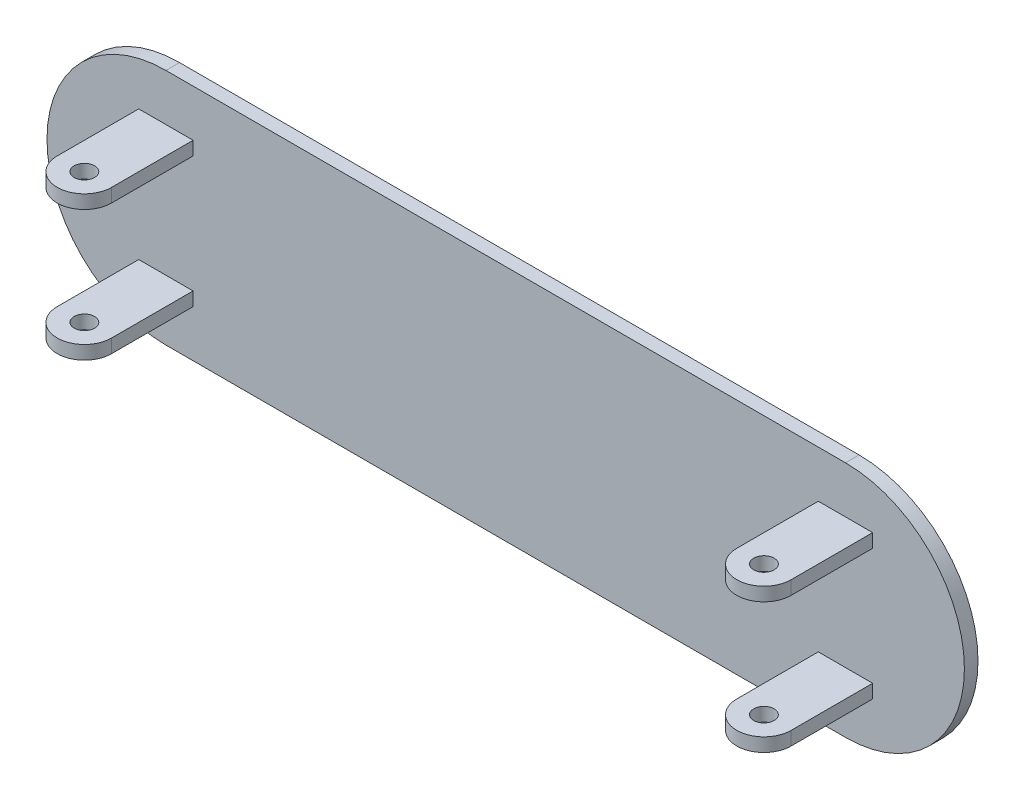
ISO-10303-21;
HEADER;
FILE_DESCRIPTION(('STEP AP214'),'2;1');
FILE_NAME('part.step','',(''),(''),'','','');
FILE_SCHEMA(('AUTOMOTIVE_DESIGN { 1 0 10303 214 1 1 1 1 }'));
ENDSEC;
DATA;
#1=APPLICATION_CONTEXT('core data for automotive mechanical design processes');
#2=APPLICATION_PROTOCOL_DEFINITION('international standard','automotive_design',2000,#1);
#3=PRODUCT_CONTEXT('',#1,'mechanical');
#4=PRODUCT('Part','Part','',(#3));
#5=PRODUCT_RELATED_PRODUCT_CATEGORY('part','',(#4));
#6=PRODUCT_DEFINITION_FORMATION('','',#4);
#7=PRODUCT_DEFINITION_CONTEXT('part definition',#1,'design');
#8=PRODUCT_DEFINITION('design','',#6,#7);
#9=PRODUCT_DEFINITION_SHAPE('','',#8);
#10=(LENGTH_UNIT() NAMED_UNIT(*) SI_UNIT(.MILLI.,.METRE.));
#11=(NAMED_UNIT(*) PLANE_ANGLE_UNIT() SI_UNIT($,.RADIAN.));
#12=(NAMED_UNIT(*) SI_UNIT($,.STERADIAN.) SOLID_ANGLE_UNIT());
#13=UNCERTAINTY_MEASURE_WITH_UNIT(LENGTH_MEASURE(1.E-05),#10,'distance_accuracy_value','');
#14=(GEOMETRIC_REPRESENTATION_CONTEXT(3) GLOBAL_UNCERTAINTY_ASSIGNED_CONTEXT((#13)) GLOBAL_UNIT_ASSIGNED_CONTEXT((#10,
#11,#12)) REPRESENTATION_CONTEXT('',''));
#15=CARTESIAN_POINT('',(0.,0.,0.));
#16=DIRECTION('',(0.,0.,1.));
#17=DIRECTION('',(1.,0.,0.));
#18=AXIS2_PLACEMENT_3D('',#15,#16,#17);
#19=CARTESIAN_POINT('',(46.,-8.6,21.));
#20=DIRECTION('',(1.,0.,0.));
#21=DIRECTION('',(0.,0.,-1.));
#22=AXIS2_PLACEMENT_3D('',#19,#20,#21);
#23=PLANE('',#22);
#24=DIRECTION('',(0.,1.,0.));
#25=VECTOR('',#24,1.);
#26=CARTESIAN_POINT('',(46.,-17.501,13.));
#27=LINE('',#26,#25);
#28=CARTESIAN_POINT('',(46.,-10.6,13.));
#29=VERTEX_POINT('',#28);
#30=CARTESIAN_POINT('',(46.,-8.6,13.));
#31=VERTEX_POINT('',#30);
#32=EDGE_CURVE('E184',#29,#31,#27,.T.);
#33=ORIENTED_EDGE('',*,*,#32,.T.);
#34=DIRECTION('',(0.,0.,-1.));
#35=VECTOR('',#34,1.);
#36=CARTESIAN_POINT('',(46.,-8.6,21.));
#37=LINE('',#36,#35);
#38=CARTESIAN_POINT('',(46.,-8.6,1.));
#39=VERTEX_POINT('',#38);
#40=EDGE_CURVE('E694',#31,#39,#37,.T.);
#41=ORIENTED_EDGE('',*,*,#40,.T.);
#42=DIRECTION('',(0.,-1.,0.));
#43=VECTOR('',#42,1.);
#44=CARTESIAN_POINT('',(46.,-8.6,1.));
#45=LINE('',#44,#43);
#46=CARTESIAN_POINT('',(46.,-10.6,1.));
#47=VERTEX_POINT('',#46);
#48=EDGE_CURVE('E204',#39,#47,#45,.T.);
#49=ORIENTED_EDGE('',*,*,#48,.T.);
#50=DIRECTION('',(0.,0.,-1.));
#51=VECTOR('',#50,1.);
#52=CARTESIAN_POINT('',(46.,-10.6,21.));
#53=LINE('',#52,#51);
#54=EDGE_CURVE('E198',#29,#47,#53,.T.);
#55=ORIENTED_EDGE('',*,*,#54,.F.);
#56=EDGE_LOOP('',(#33,#41,#49,#55));
#57=FACE_BOUND('',#56,.T.);
#58=ADVANCED_FACE('F47',(#57),#23,.F.);
#59=CARTESIAN_POINT('',(-50.,0.,1.));
#60=DIRECTION('',(0.,0.,1.));
#61=DIRECTION('',(1.,0.,0.));
#62=AXIS2_PLACEMENT_3D('',#59,#60,#61);
#63=PLANE('',#62);
#64=DIRECTION('',(0.,1.,0.));
#65=VECTOR('',#64,1.);
#66=CARTESIAN_POINT('',(46.,8.6,1.));
#67=LINE('',#66,#65);
#68=CARTESIAN_POINT('',(46.,8.6,1.));
#69=VERTEX_POINT('',#68);
#70=CARTESIAN_POINT('',(46.,10.6,1.));
#71=VERTEX_POINT('',#70);
#72=EDGE_CURVE('E234',#69,#71,#67,.T.);
#73=ORIENTED_EDGE('',*,*,#72,.T.);
#74=DIRECTION('',(1.,0.,0.));
#75=VECTOR('',#74,1.);
#76=CARTESIAN_POINT('',(54.,10.6,1.));
#77=LINE('',#76,#75);
#78=CARTESIAN_POINT('',(54.,10.6,1.));
#79=VERTEX_POINT('',#78);
#80=EDGE_CURVE('E246',#71,#79,#77,.T.);
#81=ORIENTED_EDGE('',*,*,#80,.T.);
#82=DIRECTION('',(0.,-1.,0.));
#83=VECTOR('',#82,1.);
#84=CARTESIAN_POINT('',(54.,8.6,1.));
#85=LINE('',#84,#83);
#86=CARTESIAN_POINT('',(54.,8.6,1.));
#87=VERTEX_POINT('',#86);
#88=EDGE_CURVE('E242',#79,#87,#85,.T.);
#89=ORIENTED_EDGE('',*,*,#88,.T.);
#90=DIRECTION('',(-1.,0.,0.));
#91=VECTOR('',#90,1.);
#92=CARTESIAN_POINT('',(54.,8.6,1.));
#93=LINE('',#92,#91);
#94=EDGE_CURVE('E238',#87,#69,#93,.T.);
#95=ORIENTED_EDGE('',*,*,#94,.T.);
#96=EDGE_LOOP('',(#73,#81,#89,#95));
#97=FACE_BOUND('',#96,.T.);
#98=DIRECTION('',(0.,-1.,0.));
#99=VECTOR('',#98,1.);
#100=CARTESIAN_POINT('',(-46.,-8.6,1.));
#101=LINE('',#100,#99);
#102=CARTESIAN_POINT('',(-46.,-8.6,1.));
#103=VERTEX_POINT('',#102);
#104=CARTESIAN_POINT('',(-46.,-10.6,1.));
#105=VERTEX_POINT('',#104);
#106=EDGE_CURVE('E284',#103,#105,#101,.T.);
#107=ORIENTED_EDGE('',*,*,#106,.T.);
#108=DIRECTION('',(-1.,0.,0.));
#109=VECTOR('',#108,1.);
#110=CARTESIAN_POINT('',(-54.,-10.6,1.));
#111=LINE('',#110,#109);
#112=CARTESIAN_POINT('',(-54.,-10.6,1.));
#113=VERTEX_POINT('',#112);
#114=EDGE_CURVE('E296',#105,#113,#111,.T.);
#115=ORIENTED_EDGE('',*,*,#114,.T.);
#116=DIRECTION('',(0.,1.,0.));
#117=VECTOR('',#116,1.);
#118=CARTESIAN_POINT('',(-54.,-8.6,1.));
#119=LINE('',#118,#117);
#120=CARTESIAN_POINT('',(-54.,-8.6,1.));
#121=VERTEX_POINT('',#120);
#122=EDGE_CURVE('E292',#113,#121,#119,.T.);
#123=ORIENTED_EDGE('',*,*,#122,.T.);
#124=DIRECTION('',(1.,0.,0.));
#125=VECTOR('',#124,1.);
#126=CARTESIAN_POINT('',(-54.,-8.6,1.));
#127=LINE('',#126,#125);
#128=EDGE_CURVE('E288',#121,#103,#127,.T.);
#129=ORIENTED_EDGE('',*,*,#128,.T.);
#130=EDGE_LOOP('',(#107,#115,#123,#129));
#131=FACE_BOUND('',#130,.T.);
#132=CARTESIAN_POINT('',(-50.,0.,1.));
#133=DIRECTION('',(0.,0.,1.));
#134=DIRECTION('',(1.,0.,0.));
#135=AXIS2_PLACEMENT_3D('',#132,#133,#134);
#136=CIRCLE('',#135,17.5);
#137=CARTESIAN_POINT('',(-50.,17.5,1.));
#138=VERTEX_POINT('',#137);
#139=CARTESIAN_POINT('',(-50.,-17.5,1.));
#140=VERTEX_POINT('',#139);
#141=EDGE_CURVE('E362',#138,#140,#136,.T.);
#142=ORIENTED_EDGE('',*,*,#141,.T.);
#143=DIRECTION('',(1.,0.,0.));
#144=VECTOR('',#143,1.);
#145=CARTESIAN_POINT('',(-50.,-17.5,1.));
#146=LINE('',#145,#144);
#147=CARTESIAN_POINT('',(50.,-17.5,1.));
#148=VERTEX_POINT('',#147);
#149=EDGE_CURVE('E366',#140,#148,#146,.T.);
#150=ORIENTED_EDGE('',*,*,#149,.T.);
#151=CARTESIAN_POINT('',(50.,0.,1.));
#152=DIRECTION('',(0.,0.,1.));
#153=DIRECTION('',(1.,0.,0.));
#154=AXIS2_PLACEMENT_3D('',#151,#152,#153);
#155=CIRCLE('',#154,17.5);
#156=CARTESIAN_POINT('',(50.,17.5,1.));
#157=VERTEX_POINT('',#156);
#158=EDGE_CURVE('E370',#148,#157,#155,.T.);
#159=ORIENTED_EDGE('',*,*,#158,.T.);
#160=DIRECTION('',(-1.,0.,0.));
#161=VECTOR('',#160,1.);
#162=CARTESIAN_POINT('',(-50.,17.5,1.));
#163=LINE('',#162,#161);
#164=EDGE_CURVE('E373',#157,#138,#163,.T.);
#165=ORIENTED_EDGE('',*,*,#164,.T.);
#166=EDGE_LOOP('',(#142,#150,#159,#165));
#167=FACE_BOUND('',#166,.T.);
#168=DIRECTION('',(-1.,0.,0.));
#169=VECTOR('',#168,1.);
#170=CARTESIAN_POINT('',(-54.,10.6,1.));
#171=LINE('',#170,#169);
#172=CARTESIAN_POINT('',(-46.,10.6,1.));
#173=VERTEX_POINT('',#172);
#174=CARTESIAN_POINT('',(-54.,10.6,1.));
#175=VERTEX_POINT('',#174);
#176=EDGE_CURVE('E337',#173,#175,#171,.T.);
#177=ORIENTED_EDGE('',*,*,#176,.F.);
#178=DIRECTION('',(0.,1.,0.));
#179=VECTOR('',#178,1.);
#180=CARTESIAN_POINT('',(-46.,8.6,1.));
#181=LINE('',#180,#179);
#182=CARTESIAN_POINT('',(-46.,8.6,1.));
#183=VERTEX_POINT('',#182);
#184=EDGE_CURVE('E333',#183,#173,#181,.T.);
#185=ORIENTED_EDGE('',*,*,#184,.F.);
#186=DIRECTION('',(1.,0.,0.));
#187=VECTOR('',#186,1.);
#188=CARTESIAN_POINT('',(-54.,8.6,1.));
#189=LINE('',#188,#187);
#190=CARTESIAN_POINT('',(-54.,8.6,1.));
#191=VERTEX_POINT('',#190);
#192=EDGE_CURVE('E345',#191,#183,#189,.T.);
#193=ORIENTED_EDGE('',*,*,#192,.F.);
#194=DIRECTION('',(0.,-1.,0.));
#195=VECTOR('',#194,1.);
#196=CARTESIAN_POINT('',(-54.,8.6,1.));
#197=LINE('',#196,#195);
#198=EDGE_CURVE('E341',#175,#191,#197,.T.);
#199=ORIENTED_EDGE('',*,*,#198,.F.);
#200=EDGE_LOOP('',(#177,#185,#193,#199));
#201=FACE_BOUND('',#200,.T.);
#202=DIRECTION('',(1.,0.,0.));
#203=VECTOR('',#202,1.);
#204=CARTESIAN_POINT('',(54.,-10.6,1.));
#205=LINE('',#204,#203);
#206=CARTESIAN_POINT('',(54.,-10.6,1.));
#207=VERTEX_POINT('',#206);
#208=EDGE_CURVE('E682',#47,#207,#205,.T.);
#209=ORIENTED_EDGE('',*,*,#208,.F.);
#210=ORIENTED_EDGE('',*,*,#48,.F.);
#211=DIRECTION('',(-1.,0.,0.));
#212=VECTOR('',#211,1.);
#213=CARTESIAN_POINT('',(54.,-8.6,1.));
#214=LINE('',#213,#212);
#215=CARTESIAN_POINT('',(54.,-8.6,1.));
#216=VERTEX_POINT('',#215);
#217=EDGE_CURVE('E691',#216,#39,#214,.T.);
#218=ORIENTED_EDGE('',*,*,#217,.F.);
#219=DIRECTION('',(0.,1.,0.));
#220=VECTOR('',#219,1.);
#221=CARTESIAN_POINT('',(54.,-8.6,1.));
#222=LINE('',#221,#220);
#223=EDGE_CURVE('E688',#207,#216,#222,.T.);
#224=ORIENTED_EDGE('',*,*,#223,.F.);
#225=EDGE_LOOP('',(#209,#210,#218,#224));
#226=FACE_BOUND('',#225,.T.);
#227=ADVANCED_FACE('F415',(#97,#131,#167,#201,#226),#63,.T.);
#228=CARTESIAN_POINT('',(54.,8.6,21.));
#229=DIRECTION('',(1.,0.,0.));
#230=DIRECTION('',(0.,0.,-1.));
#231=AXIS2_PLACEMENT_3D('',#228,#229,#230);
#232=PLANE('',#231);
#233=DIRECTION('',(0.,0.,-1.));
#234=VECTOR('',#233,1.);
#235=CARTESIAN_POINT('',(54.,10.6,21.));
#236=LINE('',#235,#234);
#237=CARTESIAN_POINT('',(54.,10.6,13.));
#238=VERTEX_POINT('',#237);
#239=EDGE_CURVE('E253',#238,#79,#236,.T.);
#240=ORIENTED_EDGE('',*,*,#239,.F.);
#241=DIRECTION('',(0.,-1.,0.));
#242=VECTOR('',#241,1.);
#243=CARTESIAN_POINT('',(54.,17.501,13.));
#244=LINE('',#243,#242);
#245=CARTESIAN_POINT('',(54.,8.6,13.));
#246=VERTEX_POINT('',#245);
#247=EDGE_CURVE('E219',#238,#246,#244,.T.);
#248=ORIENTED_EDGE('',*,*,#247,.T.);
#249=DIRECTION('',(0.,0.,-1.));
#250=VECTOR('',#249,1.);
#251=CARTESIAN_POINT('',(54.,8.6,21.));
#252=LINE('',#251,#250);
#253=EDGE_CURVE('E256',#246,#87,#252,.T.);
#254=ORIENTED_EDGE('',*,*,#253,.T.);
#255=ORIENTED_EDGE('',*,*,#88,.F.);
#256=EDGE_LOOP('',(#240,#248,#254,#255));
#257=FACE_BOUND('',#256,.T.);
#258=ADVANCED_FACE('F432',(#257),#232,.T.);
#259=CARTESIAN_POINT('',(-54.,-8.6,21.));
#260=DIRECTION('',(-1.,0.,0.));
#261=DIRECTION('',(0.,0.,1.));
#262=AXIS2_PLACEMENT_3D('',#259,#260,#261);
#263=PLANE('',#262);
#264=DIRECTION('',(0.,0.,-1.));
#265=VECTOR('',#264,1.);
#266=CARTESIAN_POINT('',(-54.,-10.6,21.));
#267=LINE('',#266,#265);
#268=CARTESIAN_POINT('',(-54.,-10.6,13.));
#269=VERTEX_POINT('',#268);
#270=EDGE_CURVE('E303',#269,#113,#267,.T.);
#271=ORIENTED_EDGE('',*,*,#270,.F.);
#272=DIRECTION('',(0.,1.,0.));
#273=VECTOR('',#272,1.);
#274=CARTESIAN_POINT('',(-54.,-17.501,13.));
#275=LINE('',#274,#273);
#276=CARTESIAN_POINT('',(-54.,-8.6,13.));
#277=VERTEX_POINT('',#276);
#278=EDGE_CURVE('E269',#269,#277,#275,.T.);
#279=ORIENTED_EDGE('',*,*,#278,.T.);
#280=DIRECTION('',(0.,0.,-1.));
#281=VECTOR('',#280,1.);
#282=CARTESIAN_POINT('',(-54.,-8.6,21.));
#283=LINE('',#282,#281);
#284=EDGE_CURVE('E306',#277,#121,#283,.T.);
#285=ORIENTED_EDGE('',*,*,#284,.T.);
#286=ORIENTED_EDGE('',*,*,#122,.F.);
#287=EDGE_LOOP('',(#271,#279,#285,#286));
#288=FACE_BOUND('',#287,.T.);
#289=ADVANCED_FACE('F453',(#288),#263,.T.);
#290=CARTESIAN_POINT('',(-46.,8.6,21.));
#291=DIRECTION('',(-1.,0.,0.));
#292=DIRECTION('',(0.,0.,1.));
#293=AXIS2_PLACEMENT_3D('',#290,#291,#292);
#294=PLANE('',#293);
#295=DIRECTION('',(0.,-1.,0.));
#296=VECTOR('',#295,1.);
#297=CARTESIAN_POINT('',(-46.,17.501,13.));
#298=LINE('',#297,#296);
#299=CARTESIAN_POINT('',(-46.,10.6,13.));
#300=VERTEX_POINT('',#299);
#301=CARTESIAN_POINT('',(-46.,8.6,13.));
#302=VERTEX_POINT('',#301);
#303=EDGE_CURVE('E313',#300,#302,#298,.T.);
#304=ORIENTED_EDGE('',*,*,#303,.T.);
#305=DIRECTION('',(0.,0.,-1.));
#306=VECTOR('',#305,1.);
#307=CARTESIAN_POINT('',(-46.,8.6,21.));
#308=LINE('',#307,#306);
#309=EDGE_CURVE('E349',#302,#183,#308,.T.);
#310=ORIENTED_EDGE('',*,*,#309,.T.);
#311=ORIENTED_EDGE('',*,*,#184,.T.);
#312=DIRECTION('',(0.,0.,-1.));
#313=VECTOR('',#312,1.);
#314=CARTESIAN_POINT('',(-46.,10.6,21.));
#315=LINE('',#314,#313);
#316=EDGE_CURVE('E358',#300,#173,#315,.T.);
#317=ORIENTED_EDGE('',*,*,#316,.F.);
#318=EDGE_LOOP('',(#304,#310,#311,#317));
#319=FACE_BOUND('',#318,.T.);
#320=ADVANCED_FACE('F424',(#319),#294,.F.);
#321=CARTESIAN_POINT('',(-50.,0.,1.));
#322=DIRECTION('',(0.,0.,-1.));
#323=DIRECTION('',(-1.,0.,0.));
#324=AXIS2_PLACEMENT_3D('',#321,#322,#323);
#325=CYLINDRICAL_SURFACE('',#324,17.5);
#326=CARTESIAN_POINT('',(-50.,0.,-1.));
#327=DIRECTION('',(0.,0.,1.));
#328=DIRECTION('',(1.,0.,0.));
#329=AXIS2_PLACEMENT_3D('',#326,#327,#328);
#330=CIRCLE('',#329,17.5);
#331=CARTESIAN_POINT('',(-50.,17.5,-1.));
#332=VERTEX_POINT('',#331);
#333=CARTESIAN_POINT('',(-50.,-17.5,-1.));
#334=VERTEX_POINT('',#333);
#335=EDGE_CURVE('E361',#332,#334,#330,.T.);
#336=ORIENTED_EDGE('',*,*,#335,.T.);
#337=DIRECTION('',(0.,0.,-1.));
#338=VECTOR('',#337,1.);
#339=CARTESIAN_POINT('',(-50.,-17.5,1.));
#340=LINE('',#339,#338);
#341=EDGE_CURVE('E11',#140,#334,#340,.T.);
#342=ORIENTED_EDGE('',*,*,#341,.F.);
#343=ORIENTED_EDGE('',*,*,#141,.F.);
#344=DIRECTION('',(0.,0.,-1.));
#345=VECTOR('',#344,1.);
#346=CARTESIAN_POINT('',(-50.,17.5,1.));
#347=LINE('',#346,#345);
#348=EDGE_CURVE('E376',#138,#332,#347,.T.);
#349=ORIENTED_EDGE('',*,*,#348,.T.);
#350=EDGE_LOOP('',(#336,#342,#343,#349));
#351=FACE_BOUND('',#350,.T.);
#352=ADVANCED_FACE('F49',(#351),#325,.T.);
#353=CARTESIAN_POINT('',(-50.,-17.5,1.));
#354=DIRECTION('',(0.,1.,0.));
#355=DIRECTION('',(-1.,0.,0.));
#356=AXIS2_PLACEMENT_3D('',#353,#354,#355);
#357=PLANE('',#356);
#358=DIRECTION('',(1.,0.,0.));
#359=VECTOR('',#358,1.);
#360=CARTESIAN_POINT('',(-50.,-17.5,-1.));
#361=LINE('',#360,#359);
#362=CARTESIAN_POINT('',(50.,-17.5,-1.));
#363=VERTEX_POINT('',#362);
#364=EDGE_CURVE('E380',#334,#363,#361,.T.);
#365=ORIENTED_EDGE('',*,*,#364,.T.);
#366=DIRECTION('',(0.,0.,-1.));
#367=VECTOR('',#366,1.);
#368=CARTESIAN_POINT('',(50.,-17.5,1.));
#369=LINE('',#368,#367);
#370=EDGE_CURVE('E56',#148,#363,#369,.T.);
#371=ORIENTED_EDGE('',*,*,#370,.F.);
#372=ORIENTED_EDGE('',*,*,#149,.F.);
#373=ORIENTED_EDGE('',*,*,#341,.T.);
#374=EDGE_LOOP('',(#365,#371,#372,#373));
#375=FACE_BOUND('',#374,.T.);
#376=ADVANCED_FACE('F417',(#375),#357,.F.);
#377=CARTESIAN_POINT('',(50.,0.,1.));
#378=DIRECTION('',(0.,0.,-1.));
#379=DIRECTION('',(-1.,0.,0.));
#380=AXIS2_PLACEMENT_3D('',#377,#378,#379);
#381=CYLINDRICAL_SURFACE('',#380,17.5);
#382=CARTESIAN_POINT('',(50.,0.,-1.));
#383=DIRECTION('',(0.,0.,1.));
#384=DIRECTION('',(1.,0.,0.));
#385=AXIS2_PLACEMENT_3D('',#382,#383,#384);
#386=CIRCLE('',#385,17.5);
#387=CARTESIAN_POINT('',(50.,17.5,-1.));
#388=VERTEX_POINT('',#387);
#389=EDGE_CURVE('E383',#363,#388,#386,.T.);
#390=ORIENTED_EDGE('',*,*,#389,.T.);
#391=DIRECTION('',(0.,0.,-1.));
#392=VECTOR('',#391,1.);
#393=CARTESIAN_POINT('',(50.,17.5,1.));
#394=LINE('',#393,#392);
#395=EDGE_CURVE('E391',#157,#388,#394,.T.);
#396=ORIENTED_EDGE('',*,*,#395,.F.);
#397=ORIENTED_EDGE('',*,*,#158,.F.);
#398=ORIENTED_EDGE('',*,*,#370,.T.);
#399=EDGE_LOOP('',(#390,#396,#397,#398));
#400=FACE_BOUND('',#399,.T.);
#401=ADVANCED_FACE('F400',(#400),#381,.T.);
#402=CARTESIAN_POINT('',(-50.,17.5,1.));
#403=DIRECTION('',(0.,-1.,0.));
#404=DIRECTION('',(1.,0.,0.));
#405=AXIS2_PLACEMENT_3D('',#402,#403,#404);
#406=PLANE('',#405);
#407=DIRECTION('',(-1.,0.,0.));
#408=VECTOR('',#407,1.);
#409=CARTESIAN_POINT('',(-50.,17.5,-1.));
#410=LINE('',#409,#408);
#411=EDGE_CURVE('E367',#388,#332,#410,.T.);
#412=ORIENTED_EDGE('',*,*,#411,.T.);
#413=ORIENTED_EDGE('',*,*,#348,.F.);
#414=ORIENTED_EDGE('',*,*,#164,.F.);
#415=ORIENTED_EDGE('',*,*,#395,.T.);
#416=EDGE_LOOP('',(#412,#413,#414,#415));
#417=FACE_BOUND('',#416,.T.);
#418=ADVANCED_FACE('F409',(#417),#406,.F.);
#419=CARTESIAN_POINT('',(-50.,0.,-1.));
#420=DIRECTION('',(0.,0.,1.));
#421=DIRECTION('',(1.,0.,0.));
#422=AXIS2_PLACEMENT_3D('',#419,#420,#421);
#423=PLANE('',#422);
#424=ORIENTED_EDGE('',*,*,#335,.F.);
#425=ORIENTED_EDGE('',*,*,#411,.F.);
#426=ORIENTED_EDGE('',*,*,#389,.F.);
#427=ORIENTED_EDGE('',*,*,#364,.F.);
#428=EDGE_LOOP('',(#424,#425,#426,#427));
#429=FACE_BOUND('',#428,.T.);
#430=ADVANCED_FACE('F406',(#429),#423,.F.);
#431=CARTESIAN_POINT('',(-54.,10.6,21.));
#432=DIRECTION('',(0.,-1.,0.));
#433=DIRECTION('',(0.,0.,-1.));
#434=AXIS2_PLACEMENT_3D('',#431,#432,#433);
#435=PLANE('',#434);
#436=CARTESIAN_POINT('',(-50.,10.6,13.));
#437=DIRECTION('',(0.,-1.,0.));
#438=DIRECTION('',(0.,0.,-1.));
#439=AXIS2_PLACEMENT_3D('',#436,#437,#438);
#440=CIRCLE('',#439,1.5);
#441=CARTESIAN_POINT('',(-50.,10.6,11.5));
#442=VERTEX_POINT('',#441);
#443=EDGE_CURVE('E329',#442,#442,#440,.F.);
#444=ORIENTED_EDGE('',*,*,#443,.F.);
#445=EDGE_LOOP('',(#444));
#446=FACE_BOUND('',#445,.T.);
#447=DIRECTION('',(0.,0.,-1.));
#448=VECTOR('',#447,1.);
#449=CARTESIAN_POINT('',(-54.,10.6,21.));
#450=LINE('',#449,#448);
#451=CARTESIAN_POINT('',(-54.,10.6,13.));
#452=VERTEX_POINT('',#451);
#453=EDGE_CURVE('E355',#452,#175,#450,.T.);
#454=ORIENTED_EDGE('',*,*,#453,.F.);
#455=CARTESIAN_POINT('',(-50.,10.6,13.));
#456=DIRECTION('',(0.,-1.,0.));
#457=DIRECTION('',(0.,0.,-1.));
#458=AXIS2_PLACEMENT_3D('',#455,#456,#457);
#459=CIRCLE('',#458,4.00000000000001);
#460=EDGE_CURVE('E322',#300,#452,#459,.T.);
#461=ORIENTED_EDGE('',*,*,#460,.F.);
#462=ORIENTED_EDGE('',*,*,#316,.T.);
#463=ORIENTED_EDGE('',*,*,#176,.T.);
#464=EDGE_LOOP('',(#454,#461,#462,#463));
#465=FACE_BOUND('',#464,.T.);
#466=ADVANCED_FACE('F499',(#446,#465),#435,.F.);
#467=CARTESIAN_POINT('',(-54.,8.6,21.));
#468=DIRECTION('',(1.,0.,0.));
#469=DIRECTION('',(0.,0.,-1.));
#470=AXIS2_PLACEMENT_3D('',#467,#468,#469);
#471=PLANE('',#470);
#472=DIRECTION('',(0.,0.,-1.));
#473=VECTOR('',#472,1.);
#474=CARTESIAN_POINT('',(-54.,8.6,21.));
#475=LINE('',#474,#473);
#476=CARTESIAN_POINT('',(-54.,8.6,13.));
#477=VERTEX_POINT('',#476);
#478=EDGE_CURVE('E352',#477,#191,#475,.T.);
#479=ORIENTED_EDGE('',*,*,#478,.F.);
#480=DIRECTION('',(0.,-1.,0.));
#481=VECTOR('',#480,1.);
#482=CARTESIAN_POINT('',(-54.,17.501,13.));
#483=LINE('',#482,#481);
#484=EDGE_CURVE('E312',#452,#477,#483,.T.);
#485=ORIENTED_EDGE('',*,*,#484,.F.);
#486=ORIENTED_EDGE('',*,*,#453,.T.);
#487=ORIENTED_EDGE('',*,*,#198,.T.);
#488=EDGE_LOOP('',(#479,#485,#486,#487));
#489=FACE_BOUND('',#488,.T.);
#490=ADVANCED_FACE('F495',(#489),#471,.F.);
#491=CARTESIAN_POINT('',(-54.,8.6,21.));
#492=DIRECTION('',(0.,1.,0.));
#493=DIRECTION('',(0.,0.,1.));
#494=AXIS2_PLACEMENT_3D('',#491,#492,#493);
#495=PLANE('',#494);
#496=CARTESIAN_POINT('',(-50.,8.6,13.));
#497=DIRECTION('',(0.,-1.,0.));
#498=DIRECTION('',(0.,0.,-1.));
#499=AXIS2_PLACEMENT_3D('',#496,#497,#498);
#500=CIRCLE('',#499,1.5);
#501=CARTESIAN_POINT('',(-50.,8.6,11.5));
#502=VERTEX_POINT('',#501);
#503=EDGE_CURVE('E325',#502,#502,#500,.T.);
#504=ORIENTED_EDGE('',*,*,#503,.F.);
#505=EDGE_LOOP('',(#504));
#506=FACE_BOUND('',#505,.T.);
#507=ORIENTED_EDGE('',*,*,#309,.F.);
#508=CARTESIAN_POINT('',(-50.,8.6,13.));
#509=DIRECTION('',(0.,1.,0.));
#510=DIRECTION('',(0.,0.,-1.));
#511=AXIS2_PLACEMENT_3D('',#508,#509,#510);
#512=CIRCLE('',#511,4.00000000000001);
#513=EDGE_CURVE('E317',#477,#302,#512,.T.);
#514=ORIENTED_EDGE('',*,*,#513,.F.);
#515=ORIENTED_EDGE('',*,*,#478,.T.);
#516=ORIENTED_EDGE('',*,*,#192,.T.);
#517=EDGE_LOOP('',(#507,#514,#515,#516));
#518=FACE_BOUND('',#517,.T.);
#519=ADVANCED_FACE('F491',(#506,#518),#495,.F.);
#520=CARTESIAN_POINT('',(-50.,17.501,13.));
#521=DIRECTION('',(0.,-1.,0.));
#522=DIRECTION('',(0.,0.,-1.));
#523=AXIS2_PLACEMENT_3D('',#520,#521,#522);
#524=CYLINDRICAL_SURFACE('',#523,1.5);
#525=ORIENTED_EDGE('',*,*,#503,.T.);
#526=EDGE_LOOP('',(#525));
#527=FACE_BOUND('',#526,.T.);
#528=ORIENTED_EDGE('',*,*,#443,.T.);
#529=EDGE_LOOP('',(#528));
#530=FACE_BOUND('',#529,.T.);
#531=ADVANCED_FACE('F487',(#527,#530),#524,.F.);
#532=CARTESIAN_POINT('',(-50.,17.501,13.));
#533=DIRECTION('',(0.,-1.,0.));
#534=DIRECTION('',(0.,0.,-1.));
#535=AXIS2_PLACEMENT_3D('',#532,#533,#534);
#536=CYLINDRICAL_SURFACE('',#535,4.00000000000001);
#537=ORIENTED_EDGE('',*,*,#460,.T.);
#538=ORIENTED_EDGE('',*,*,#484,.T.);
#539=ORIENTED_EDGE('',*,*,#513,.T.);
#540=ORIENTED_EDGE('',*,*,#303,.F.);
#541=EDGE_LOOP('',(#537,#538,#539,#540));
#542=FACE_BOUND('',#541,.T.);
#543=ADVANCED_FACE('F483',(#542),#536,.T.);
#544=CARTESIAN_POINT('',(-46.,-8.6,21.));
#545=DIRECTION('',(1.,0.,0.));
#546=DIRECTION('',(0.,0.,-1.));
#547=AXIS2_PLACEMENT_3D('',#544,#545,#546);
#548=PLANE('',#547);
#549=DIRECTION('',(0.,1.,0.));
#550=VECTOR('',#549,1.);
#551=CARTESIAN_POINT('',(-46.,-17.501,13.));
#552=LINE('',#551,#550);
#553=CARTESIAN_POINT('',(-46.,-10.6,13.));
#554=VERTEX_POINT('',#553);
#555=CARTESIAN_POINT('',(-46.,-8.6,13.));
#556=VERTEX_POINT('',#555);
#557=EDGE_CURVE('E270',#554,#556,#552,.T.);
#558=ORIENTED_EDGE('',*,*,#557,.F.);
#559=DIRECTION('',(0.,0.,-1.));
#560=VECTOR('',#559,1.);
#561=CARTESIAN_POINT('',(-46.,-10.6,21.));
#562=LINE('',#561,#560);
#563=EDGE_CURVE('E300',#554,#105,#562,.T.);
#564=ORIENTED_EDGE('',*,*,#563,.T.);
#565=ORIENTED_EDGE('',*,*,#106,.F.);
#566=DIRECTION('',(0.,0.,-1.));
#567=VECTOR('',#566,1.);
#568=CARTESIAN_POINT('',(-46.,-8.6,21.));
#569=LINE('',#568,#567);
#570=EDGE_CURVE('E309',#556,#103,#569,.T.);
#571=ORIENTED_EDGE('',*,*,#570,.F.);
#572=EDGE_LOOP('',(#558,#564,#565,#571));
#573=FACE_BOUND('',#572,.T.);
#574=ADVANCED_FACE('F479',(#573),#548,.T.);
#575=CARTESIAN_POINT('',(-54.,-8.6,21.));
#576=DIRECTION('',(0.,1.,0.));
#577=DIRECTION('',(0.,0.,1.));
#578=AXIS2_PLACEMENT_3D('',#575,#576,#577);
#579=PLANE('',#578);
#580=CARTESIAN_POINT('',(-50.,-8.6,13.));
#581=DIRECTION('',(0.,-1.,0.));
#582=DIRECTION('',(0.,0.,-1.));
#583=AXIS2_PLACEMENT_3D('',#580,#581,#582);
#584=CIRCLE('',#583,1.5);
#585=CARTESIAN_POINT('',(-50.,-8.6,11.5));
#586=VERTEX_POINT('',#585);
#587=EDGE_CURVE('E273',#586,#586,#584,.T.);
#588=ORIENTED_EDGE('',*,*,#587,.T.);
#589=EDGE_LOOP('',(#588));
#590=FACE_BOUND('',#589,.T.);
#591=ORIENTED_EDGE('',*,*,#284,.F.);
#592=CARTESIAN_POINT('',(-50.,-8.6,13.));
#593=DIRECTION('',(0.,1.,0.));
#594=DIRECTION('',(0.,0.,-1.));
#595=AXIS2_PLACEMENT_3D('',#592,#593,#594);
#596=CIRCLE('',#595,4.00000000000001);
#597=EDGE_CURVE('E265',#277,#556,#596,.T.);
#598=ORIENTED_EDGE('',*,*,#597,.T.);
#599=ORIENTED_EDGE('',*,*,#570,.T.);
#600=ORIENTED_EDGE('',*,*,#128,.F.);
#601=EDGE_LOOP('',(#591,#598,#599,#600));
#602=FACE_BOUND('',#601,.T.);
#603=ADVANCED_FACE('F472',(#590,#602),#579,.T.);
#604=CARTESIAN_POINT('',(-54.,-10.6,21.));
#605=DIRECTION('',(0.,-1.,0.));
#606=DIRECTION('',(0.,0.,-1.));
#607=AXIS2_PLACEMENT_3D('',#604,#605,#606);
#608=PLANE('',#607);
#609=CARTESIAN_POINT('',(-50.,-10.6,13.));
#610=DIRECTION('',(0.,-1.,0.));
#611=DIRECTION('',(0.,0.,-1.));
#612=AXIS2_PLACEMENT_3D('',#609,#610,#611);
#613=CIRCLE('',#612,1.5);
#614=CARTESIAN_POINT('',(-50.,-10.6,11.5));
#615=VERTEX_POINT('',#614);
#616=EDGE_CURVE('E280',#615,#615,#613,.T.);
#617=ORIENTED_EDGE('',*,*,#616,.F.);
#618=EDGE_LOOP('',(#617));
#619=FACE_BOUND('',#618,.T.);
#620=ORIENTED_EDGE('',*,*,#563,.F.);
#621=CARTESIAN_POINT('',(-50.,-10.6,13.));
#622=DIRECTION('',(0.,-1.,0.));
#623=DIRECTION('',(0.,0.,-1.));
#624=AXIS2_PLACEMENT_3D('',#621,#622,#623);
#625=CIRCLE('',#624,4.00000000000001);
#626=EDGE_CURVE('E262',#269,#554,#625,.F.);
#627=ORIENTED_EDGE('',*,*,#626,.F.);
#628=ORIENTED_EDGE('',*,*,#270,.T.);
#629=ORIENTED_EDGE('',*,*,#114,.F.);
#630=EDGE_LOOP('',(#620,#627,#628,#629));
#631=FACE_BOUND('',#630,.T.);
#632=ADVANCED_FACE('F468',(#619,#631),#608,.T.);
#633=CARTESIAN_POINT('',(-50.,-17.501,13.));
#634=DIRECTION('',(0.,1.,0.));
#635=DIRECTION('',(0.,0.,1.));
#636=AXIS2_PLACEMENT_3D('',#633,#634,#635);
#637=CYLINDRICAL_SURFACE('',#636,1.5);
#638=ORIENTED_EDGE('',*,*,#616,.T.);
#639=EDGE_LOOP('',(#638));
#640=FACE_BOUND('',#639,.T.);
#641=ORIENTED_EDGE('',*,*,#587,.F.);
#642=EDGE_LOOP('',(#641));
#643=FACE_BOUND('',#642,.T.);
#644=ADVANCED_FACE('F464',(#640,#643),#637,.F.);
#645=CARTESIAN_POINT('',(-50.,-17.501,13.));
#646=DIRECTION('',(0.,1.,0.));
#647=DIRECTION('',(0.,0.,1.));
#648=AXIS2_PLACEMENT_3D('',#645,#646,#647);
#649=CYLINDRICAL_SURFACE('',#648,4.00000000000001);
#650=ORIENTED_EDGE('',*,*,#626,.T.);
#651=ORIENTED_EDGE('',*,*,#557,.T.);
#652=ORIENTED_EDGE('',*,*,#597,.F.);
#653=ORIENTED_EDGE('',*,*,#278,.F.);
#654=EDGE_LOOP('',(#650,#651,#652,#653));
#655=FACE_BOUND('',#654,.T.);
#656=ADVANCED_FACE('F461',(#655),#649,.T.);
#657=CARTESIAN_POINT('',(46.,8.6,21.));
#658=DIRECTION('',(-1.,0.,0.));
#659=DIRECTION('',(0.,0.,1.));
#660=AXIS2_PLACEMENT_3D('',#657,#658,#659);
#661=PLANE('',#660);
#662=DIRECTION('',(0.,-1.,0.));
#663=VECTOR('',#662,1.);
#664=CARTESIAN_POINT('',(46.,17.501,13.));
#665=LINE('',#664,#663);
#666=CARTESIAN_POINT('',(46.,10.6,13.));
#667=VERTEX_POINT('',#666);
#668=CARTESIAN_POINT('',(46.,8.6,13.));
#669=VERTEX_POINT('',#668);
#670=EDGE_CURVE('E220',#667,#669,#665,.T.);
#671=ORIENTED_EDGE('',*,*,#670,.F.);
#672=DIRECTION('',(0.,0.,-1.));
#673=VECTOR('',#672,1.);
#674=CARTESIAN_POINT('',(46.,10.6,21.));
#675=LINE('',#674,#673);
#676=EDGE_CURVE('E250',#667,#71,#675,.T.);
#677=ORIENTED_EDGE('',*,*,#676,.T.);
#678=ORIENTED_EDGE('',*,*,#72,.F.);
#679=DIRECTION('',(0.,0.,-1.));
#680=VECTOR('',#679,1.);
#681=CARTESIAN_POINT('',(46.,8.6,21.));
#682=LINE('',#681,#680);
#683=EDGE_CURVE('E259',#669,#69,#682,.T.);
#684=ORIENTED_EDGE('',*,*,#683,.F.);
#685=EDGE_LOOP('',(#671,#677,#678,#684));
#686=FACE_BOUND('',#685,.T.);
#687=ADVANCED_FACE('F457',(#686),#661,.T.);
#688=CARTESIAN_POINT('',(54.,8.6,21.));
#689=DIRECTION('',(0.,-1.,0.));
#690=DIRECTION('',(0.,0.,-1.));
#691=AXIS2_PLACEMENT_3D('',#688,#689,#690);
#692=PLANE('',#691);
#693=CARTESIAN_POINT('',(50.,8.6,13.));
#694=DIRECTION('',(0.,1.,0.));
#695=DIRECTION('',(0.,0.,-1.));
#696=AXIS2_PLACEMENT_3D('',#693,#694,#695);
#697=CIRCLE('',#696,1.5);
#698=CARTESIAN_POINT('',(50.,8.6,11.5));
#699=VERTEX_POINT('',#698);
#700=EDGE_CURVE('E223',#699,#699,#697,.T.);
#701=ORIENTED_EDGE('',*,*,#700,.T.);
#702=EDGE_LOOP('',(#701));
#703=FACE_BOUND('',#702,.T.);
#704=ORIENTED_EDGE('',*,*,#253,.F.);
#705=CARTESIAN_POINT('',(50.,8.6,13.));
#706=DIRECTION('',(0.,-1.,0.));
#707=DIRECTION('',(0.,0.,-1.));
#708=AXIS2_PLACEMENT_3D('',#705,#706,#707);
#709=CIRCLE('',#708,4.00000000000001);
#710=EDGE_CURVE('E211',#246,#669,#709,.T.);
#711=ORIENTED_EDGE('',*,*,#710,.T.);
#712=ORIENTED_EDGE('',*,*,#683,.T.);
#713=ORIENTED_EDGE('',*,*,#94,.F.);
#714=EDGE_LOOP('',(#704,#711,#712,#713));
#715=FACE_BOUND('',#714,.T.);
#716=ADVANCED_FACE('F449',(#703,#715),#692,.T.);
#717=CARTESIAN_POINT('',(54.,10.6,21.));
#718=DIRECTION('',(0.,1.,0.));
#719=DIRECTION('',(0.,0.,1.));
#720=AXIS2_PLACEMENT_3D('',#717,#718,#719);
#721=PLANE('',#720);
#722=CARTESIAN_POINT('',(50.,10.6,13.));
#723=DIRECTION('',(0.,1.,0.));
#724=DIRECTION('',(0.,0.,1.));
#725=AXIS2_PLACEMENT_3D('',#722,#723,#724);
#726=CIRCLE('',#725,1.5);
#727=CARTESIAN_POINT('',(50.,10.6,14.5));
#728=VERTEX_POINT('',#727);
#729=EDGE_CURVE('E230',#728,#728,#726,.T.);
#730=ORIENTED_EDGE('',*,*,#729,.F.);
#731=EDGE_LOOP('',(#730));
#732=FACE_BOUND('',#731,.T.);
#733=ORIENTED_EDGE('',*,*,#676,.F.);
#734=CARTESIAN_POINT('',(50.,10.6,13.));
#735=DIRECTION('',(0.,1.,0.));
#736=DIRECTION('',(0.,0.,1.));
#737=AXIS2_PLACEMENT_3D('',#734,#735,#736);
#738=CIRCLE('',#737,4.00000000000001);
#739=EDGE_CURVE('E207',#238,#667,#738,.F.);
#740=ORIENTED_EDGE('',*,*,#739,.F.);
#741=ORIENTED_EDGE('',*,*,#239,.T.);
#742=ORIENTED_EDGE('',*,*,#80,.F.);
#743=EDGE_LOOP('',(#733,#740,#741,#742));
#744=FACE_BOUND('',#743,.T.);
#745=ADVANCED_FACE('F445',(#732,#744),#721,.T.);
#746=CARTESIAN_POINT('',(50.,17.501,13.));
#747=DIRECTION('',(0.,-1.,0.));
#748=DIRECTION('',(0.,0.,-1.));
#749=AXIS2_PLACEMENT_3D('',#746,#747,#748);
#750=CYLINDRICAL_SURFACE('',#749,1.5);
#751=ORIENTED_EDGE('',*,*,#729,.T.);
#752=EDGE_LOOP('',(#751));
#753=FACE_BOUND('',#752,.T.);
#754=ORIENTED_EDGE('',*,*,#700,.F.);
#755=EDGE_LOOP('',(#754));
#756=FACE_BOUND('',#755,.T.);
#757=ADVANCED_FACE('F441',(#753,#756),#750,.F.);
#758=CARTESIAN_POINT('',(50.,17.501,13.));
#759=DIRECTION('',(0.,-1.,0.));
#760=DIRECTION('',(0.,0.,-1.));
#761=AXIS2_PLACEMENT_3D('',#758,#759,#760);
#762=CYLINDRICAL_SURFACE('',#761,4.00000000000001);
#763=ORIENTED_EDGE('',*,*,#739,.T.);
#764=ORIENTED_EDGE('',*,*,#670,.T.);
#765=ORIENTED_EDGE('',*,*,#710,.F.);
#766=ORIENTED_EDGE('',*,*,#247,.F.);
#767=EDGE_LOOP('',(#763,#764,#765,#766));
#768=FACE_BOUND('',#767,.T.);
#769=ADVANCED_FACE('F438',(#768),#762,.T.);
#770=CARTESIAN_POINT('',(54.,-10.6,21.));
#771=DIRECTION('',(0.,1.,0.));
#772=DIRECTION('',(0.,0.,1.));
#773=AXIS2_PLACEMENT_3D('',#770,#771,#772);
#774=PLANE('',#773);
#775=CARTESIAN_POINT('',(50.,-10.6,13.));
#776=DIRECTION('',(0.,1.,0.));
#777=DIRECTION('',(0.,0.,1.));
#778=AXIS2_PLACEMENT_3D('',#775,#776,#777);
#779=CIRCLE('',#778,1.5);
#780=CARTESIAN_POINT('',(50.,-10.6,14.5));
#781=VERTEX_POINT('',#780);
#782=EDGE_CURVE('E677',#781,#781,#779,.F.);
#783=ORIENTED_EDGE('',*,*,#782,.F.);
#784=EDGE_LOOP('',(#783));
#785=FACE_BOUND('',#784,.T.);
#786=DIRECTION('',(0.,0.,-1.));
#787=VECTOR('',#786,1.);
#788=CARTESIAN_POINT('',(54.,-10.6,21.));
#789=LINE('',#788,#787);
#790=CARTESIAN_POINT('',(54.,-10.6,13.));
#791=VERTEX_POINT('',#790);
#792=EDGE_CURVE('E200',#791,#207,#789,.T.);
#793=ORIENTED_EDGE('',*,*,#792,.F.);
#794=CARTESIAN_POINT('',(50.,-10.6,13.));
#795=DIRECTION('',(0.,1.,0.));
#796=DIRECTION('',(0.,0.,1.));
#797=AXIS2_PLACEMENT_3D('',#794,#795,#796);
#798=CIRCLE('',#797,4.00000000000001);
#799=EDGE_CURVE('E187',#29,#791,#798,.T.);
#800=ORIENTED_EDGE('',*,*,#799,.F.);
#801=ORIENTED_EDGE('',*,*,#54,.T.);
#802=ORIENTED_EDGE('',*,*,#208,.T.);
#803=EDGE_LOOP('',(#793,#800,#801,#802));
#804=FACE_BOUND('',#803,.T.);
#805=ADVANCED_FACE('F196',(#785,#804),#774,.F.);
#806=CARTESIAN_POINT('',(54.,-8.6,21.));
#807=DIRECTION('',(-1.,0.,0.));
#808=DIRECTION('',(0.,0.,1.));
#809=AXIS2_PLACEMENT_3D('',#806,#807,#808);
#810=PLANE('',#809);
#811=DIRECTION('',(0.,0.,-1.));
#812=VECTOR('',#811,1.);
#813=CARTESIAN_POINT('',(54.,-8.6,21.));
#814=LINE('',#813,#812);
#815=CARTESIAN_POINT('',(54.,-8.6,13.));
#816=VERTEX_POINT('',#815);
#817=EDGE_CURVE('E70',#816,#216,#814,.T.);
#818=ORIENTED_EDGE('',*,*,#817,.F.);
#819=DIRECTION('',(0.,1.,0.));
#820=VECTOR('',#819,1.);
#821=CARTESIAN_POINT('',(54.,-17.501,13.));
#822=LINE('',#821,#820);
#823=EDGE_CURVE('E63',#791,#816,#822,.T.);
#824=ORIENTED_EDGE('',*,*,#823,.F.);
#825=ORIENTED_EDGE('',*,*,#792,.T.);
#826=ORIENTED_EDGE('',*,*,#223,.T.);
#827=EDGE_LOOP('',(#818,#824,#825,#826));
#828=FACE_BOUND('',#827,.T.);
#829=ADVANCED_FACE('F628',(#828),#810,.F.);
#830=CARTESIAN_POINT('',(54.,-8.6,21.));
#831=DIRECTION('',(0.,-1.,0.));
#832=DIRECTION('',(0.,0.,-1.));
#833=AXIS2_PLACEMENT_3D('',#830,#831,#832);
#834=PLANE('',#833);
#835=CARTESIAN_POINT('',(50.,-8.6,13.));
#836=DIRECTION('',(0.,1.,0.));
#837=DIRECTION('',(0.,0.,-1.));
#838=AXIS2_PLACEMENT_3D('',#835,#836,#837);
#839=CIRCLE('',#838,1.5);
#840=CARTESIAN_POINT('',(50.,-8.6,11.5));
#841=VERTEX_POINT('',#840);
#842=EDGE_CURVE('E674',#841,#841,#839,.T.);
#843=ORIENTED_EDGE('',*,*,#842,.F.);
#844=EDGE_LOOP('',(#843));
#845=FACE_BOUND('',#844,.T.);
#846=ORIENTED_EDGE('',*,*,#40,.F.);
#847=CARTESIAN_POINT('',(50.,-8.6,13.));
#848=DIRECTION('',(0.,-1.,0.));
#849=DIRECTION('',(0.,0.,-1.));
#850=AXIS2_PLACEMENT_3D('',#847,#848,#849);
#851=CIRCLE('',#850,4.00000000000001);
#852=EDGE_CURVE('E188',#816,#31,#851,.T.);
#853=ORIENTED_EDGE('',*,*,#852,.F.);
#854=ORIENTED_EDGE('',*,*,#817,.T.);
#855=ORIENTED_EDGE('',*,*,#217,.T.);
#856=EDGE_LOOP('',(#846,#853,#854,#855));
#857=FACE_BOUND('',#856,.T.);
#858=ADVANCED_FACE('F637',(#845,#857),#834,.F.);
#859=CARTESIAN_POINT('',(50.,-17.501,13.));
#860=DIRECTION('',(0.,1.,0.));
#861=DIRECTION('',(0.,0.,1.));
#862=AXIS2_PLACEMENT_3D('',#859,#860,#861);
#863=CYLINDRICAL_SURFACE('',#862,1.5);
#864=ORIENTED_EDGE('',*,*,#842,.T.);
#865=EDGE_LOOP('',(#864));
#866=FACE_BOUND('',#865,.T.);
#867=ORIENTED_EDGE('',*,*,#782,.T.);
#868=EDGE_LOOP('',(#867));
#869=FACE_BOUND('',#868,.T.);
#870=ADVANCED_FACE('F646',(#866,#869),#863,.F.);
#871=CARTESIAN_POINT('',(50.,-17.501,13.));
#872=DIRECTION('',(0.,1.,0.));
#873=DIRECTION('',(0.,0.,1.));
#874=AXIS2_PLACEMENT_3D('',#871,#872,#873);
#875=CYLINDRICAL_SURFACE('',#874,4.00000000000001);
#876=ORIENTED_EDGE('',*,*,#799,.T.);
#877=ORIENTED_EDGE('',*,*,#823,.T.);
#878=ORIENTED_EDGE('',*,*,#852,.T.);
#879=ORIENTED_EDGE('',*,*,#32,.F.);
#880=EDGE_LOOP('',(#876,#877,#878,#879));
#881=FACE_BOUND('',#880,.T.);
#882=ADVANCED_FACE('F186',(#881),#875,.T.);
#883=CLOSED_SHELL('',(#58,#227,#258,#289,#320,#352,#376,#401,#418,#430,#466,#490,#519,#531,#543,
#574,#603,#632,#644,#656,#687,#716,#745,#757,#769,#805,#829,#858,#870,#882));
#884=MANIFOLD_SOLID_BREP('B2',#883);
#885=ADVANCED_BREP_SHAPE_REPRESENTATION('',(#18,#884),#14);
#886=SHAPE_DEFINITION_REPRESENTATION(#9,#885);
ENDSEC;
END-ISO-10303-21;
